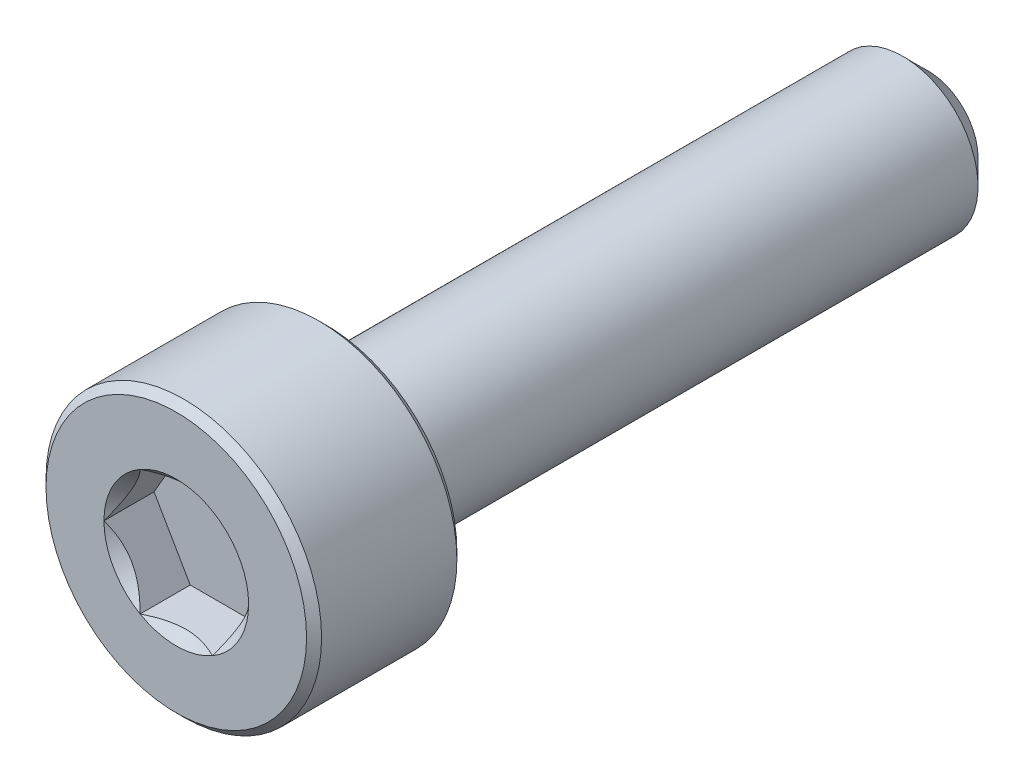
ISO-10303-21;
HEADER;
FILE_DESCRIPTION(('STEP AP214'),'2;1');
FILE_NAME('part.step','',(''),(''),'','','');
FILE_SCHEMA(('AUTOMOTIVE_DESIGN { 1 0 10303 214 1 1 1 1 }'));
ENDSEC;
DATA;
#1=APPLICATION_CONTEXT('core data for automotive mechanical design processes');
#2=APPLICATION_PROTOCOL_DEFINITION('international standard','automotive_design',2000,#1);
#3=PRODUCT_CONTEXT('',#1,'mechanical');
#4=PRODUCT('Part','Part','',(#3));
#5=PRODUCT_RELATED_PRODUCT_CATEGORY('part','',(#4));
#6=PRODUCT_DEFINITION_FORMATION('','',#4);
#7=PRODUCT_DEFINITION_CONTEXT('part definition',#1,'design');
#8=PRODUCT_DEFINITION('design','',#6,#7);
#9=PRODUCT_DEFINITION_SHAPE('','',#8);
#10=(LENGTH_UNIT() NAMED_UNIT(*) SI_UNIT(.MILLI.,.METRE.));
#11=(NAMED_UNIT(*) PLANE_ANGLE_UNIT() SI_UNIT($,.RADIAN.));
#12=(NAMED_UNIT(*) SI_UNIT($,.STERADIAN.) SOLID_ANGLE_UNIT());
#13=UNCERTAINTY_MEASURE_WITH_UNIT(LENGTH_MEASURE(1.E-05),#10,'distance_accuracy_value','');
#14=(GEOMETRIC_REPRESENTATION_CONTEXT(3) GLOBAL_UNCERTAINTY_ASSIGNED_CONTEXT((#13)) GLOBAL_UNIT_ASSIGNED_CONTEXT((#10,
#11,#12)) REPRESENTATION_CONTEXT('',''));
#15=CARTESIAN_POINT('',(0.,0.,0.));
#16=DIRECTION('',(0.,0.,1.));
#17=DIRECTION('',(1.,0.,0.));
#18=AXIS2_PLACEMENT_3D('',#15,#16,#17);
#19=CARTESIAN_POINT('',(0.,2.6,7.5));
#20=DIRECTION('',(0.,0.,1.));
#21=DIRECTION('',(1.,0.,0.));
#22=AXIS2_PLACEMENT_3D('',#19,#20,#21);
#23=PLANE('',#22);
#24=CARTESIAN_POINT('',(0.,0.,7.5));
#25=DIRECTION('',(0.,0.,1.));
#26=DIRECTION('',(1.,0.,0.));
#27=AXIS2_PLACEMENT_3D('',#24,#25,#26);
#28=CIRCLE('',#27,1.44337567297406);
#29=CARTESIAN_POINT('',(1.44337567297406,0.,7.5));
#30=VERTEX_POINT('',#29);
#31=CARTESIAN_POINT('',(0.721687836487031,1.25,7.5));
#32=VERTEX_POINT('',#31);
#33=EDGE_CURVE('E101',#30,#32,#28,.T.);
#34=ORIENTED_EDGE('',*,*,#33,.F.);
#35=CARTESIAN_POINT('',(0.721687836487031,-1.25,7.5));
#36=VERTEX_POINT('',#35);
#37=EDGE_CURVE('E61',#36,#30,#28,.T.);
#38=ORIENTED_EDGE('',*,*,#37,.F.);
#39=CARTESIAN_POINT('',(-0.721687836487033,-1.25,7.5));
#40=VERTEX_POINT('',#39);
#41=EDGE_CURVE('E331',#40,#36,#28,.T.);
#42=ORIENTED_EDGE('',*,*,#41,.F.);
#43=CARTESIAN_POINT('',(-1.44337567297406,0.,7.5));
#44=VERTEX_POINT('',#43);
#45=EDGE_CURVE('E68',#44,#40,#28,.T.);
#46=ORIENTED_EDGE('',*,*,#45,.F.);
#47=CARTESIAN_POINT('',(-0.721687836487031,1.25,7.5));
#48=VERTEX_POINT('',#47);
#49=EDGE_CURVE('E139',#48,#44,#28,.T.);
#50=ORIENTED_EDGE('',*,*,#49,.F.);
#51=EDGE_CURVE('E111',#32,#48,#28,.T.);
#52=ORIENTED_EDGE('',*,*,#51,.F.);
#53=EDGE_LOOP('',(#34,#38,#42,#46,#50,#52));
#54=FACE_BOUND('',#53,.T.);
#55=CARTESIAN_POINT('',(0.,0.,7.5));
#56=DIRECTION('',(0.,0.,-1.));
#57=DIRECTION('',(-1.,0.,0.));
#58=AXIS2_PLACEMENT_3D('',#55,#56,#57);
#59=CIRCLE('',#58,2.6);
#60=CARTESIAN_POINT('',(-2.6,0.,7.5));
#61=VERTEX_POINT('',#60);
#62=EDGE_CURVE('E55',#61,#61,#59,.T.);
#63=ORIENTED_EDGE('',*,*,#62,.F.);
#64=EDGE_LOOP('',(#63));
#65=FACE_BOUND('',#64,.T.);
#66=ADVANCED_FACE('F41',(#54,#65),#23,.T.);
#67=CARTESIAN_POINT('',(0.,0.,7.35));
#68=DIRECTION('',(0.,0.,-1.));
#69=DIRECTION('',(-1.,0.,0.));
#70=AXIS2_PLACEMENT_3D('',#67,#68,#69);
#71=CONICAL_SURFACE('',#70,2.75,0.785398163397441);
#72=ORIENTED_EDGE('',*,*,#62,.T.);
#73=EDGE_LOOP('',(#72));
#74=FACE_BOUND('',#73,.T.);
#75=CARTESIAN_POINT('',(0.,0.,7.35));
#76=DIRECTION('',(0.,0.,-1.));
#77=DIRECTION('',(-1.,0.,0.));
#78=AXIS2_PLACEMENT_3D('',#75,#76,#77);
#79=CIRCLE('',#78,2.75);
#80=CARTESIAN_POINT('',(-2.75,0.,7.35));
#81=VERTEX_POINT('',#80);
#82=EDGE_CURVE('E299',#81,#81,#79,.T.);
#83=ORIENTED_EDGE('',*,*,#82,.F.);
#84=EDGE_LOOP('',(#83));
#85=FACE_BOUND('',#84,.T.);
#86=ADVANCED_FACE('F207',(#74,#85),#71,.T.);
#87=CARTESIAN_POINT('',(0.,0.,-7.5));
#88=DIRECTION('',(0.,0.,-1.));
#89=DIRECTION('',(-1.,0.,0.));
#90=AXIS2_PLACEMENT_3D('',#87,#88,#89);
#91=CYLINDRICAL_SURFACE('',#90,2.75);
#92=ORIENTED_EDGE('',*,*,#82,.T.);
#93=EDGE_LOOP('',(#92));
#94=FACE_BOUND('',#93,.T.);
#95=CARTESIAN_POINT('',(0.,0.,4.65));
#96=DIRECTION('',(0.,0.,-1.));
#97=DIRECTION('',(-1.,0.,0.));
#98=AXIS2_PLACEMENT_3D('',#95,#96,#97);
#99=CIRCLE('',#98,2.75);
#100=CARTESIAN_POINT('',(-2.75,0.,4.65));
#101=VERTEX_POINT('',#100);
#102=EDGE_CURVE('E295',#101,#101,#99,.T.);
#103=ORIENTED_EDGE('',*,*,#102,.F.);
#104=EDGE_LOOP('',(#103));
#105=FACE_BOUND('',#104,.T.);
#106=ADVANCED_FACE('F211',(#94,#105),#91,.T.);
#107=CARTESIAN_POINT('',(0.,0.,4.5));
#108=DIRECTION('',(0.,0.,1.));
#109=DIRECTION('',(1.,0.,0.));
#110=AXIS2_PLACEMENT_3D('',#107,#108,#109);
#111=CONICAL_SURFACE('',#110,2.6,0.785398163397454);
#112=ORIENTED_EDGE('',*,*,#102,.T.);
#113=EDGE_LOOP('',(#112));
#114=FACE_BOUND('',#113,.T.);
#115=CARTESIAN_POINT('',(0.,0.,4.5));
#116=DIRECTION('',(0.,0.,-1.));
#117=DIRECTION('',(-1.,0.,0.));
#118=AXIS2_PLACEMENT_3D('',#115,#116,#117);
#119=CIRCLE('',#118,2.6);
#120=CARTESIAN_POINT('',(-2.6,0.,4.5));
#121=VERTEX_POINT('',#120);
#122=EDGE_CURVE('E291',#121,#121,#119,.T.);
#123=ORIENTED_EDGE('',*,*,#122,.F.);
#124=EDGE_LOOP('',(#123));
#125=FACE_BOUND('',#124,.T.);
#126=ADVANCED_FACE('F216',(#114,#125),#111,.T.);
#127=CARTESIAN_POINT('',(0.,2.6,4.5));
#128=DIRECTION('',(0.,0.,-1.));
#129=DIRECTION('',(-1.,0.,0.));
#130=AXIS2_PLACEMENT_3D('',#127,#128,#129);
#131=PLANE('',#130);
#132=ORIENTED_EDGE('',*,*,#122,.T.);
#133=EDGE_LOOP('',(#132));
#134=FACE_BOUND('',#133,.T.);
#135=CARTESIAN_POINT('',(0.,0.,4.5));
#136=DIRECTION('',(0.,0.,-1.));
#137=DIRECTION('',(-1.,0.,0.));
#138=AXIS2_PLACEMENT_3D('',#135,#136,#137);
#139=CIRCLE('',#138,1.5);
#140=CARTESIAN_POINT('',(-1.5,0.,4.5));
#141=VERTEX_POINT('',#140);
#142=EDGE_CURVE('E287',#141,#141,#139,.T.);
#143=ORIENTED_EDGE('',*,*,#142,.F.);
#144=EDGE_LOOP('',(#143));
#145=FACE_BOUND('',#144,.T.);
#146=ADVANCED_FACE('F224',(#134,#145),#131,.T.);
#147=CARTESIAN_POINT('',(0.,0.,-7.5));
#148=DIRECTION('',(0.,0.,-1.));
#149=DIRECTION('',(-1.,0.,0.));
#150=AXIS2_PLACEMENT_3D('',#147,#148,#149);
#151=CYLINDRICAL_SURFACE('',#150,1.5);
#152=ORIENTED_EDGE('',*,*,#142,.T.);
#153=EDGE_LOOP('',(#152));
#154=FACE_BOUND('',#153,.T.);
#155=CARTESIAN_POINT('',(0.,0.,-6.99999999999999));
#156=DIRECTION('',(0.,0.,-1.));
#157=DIRECTION('',(-1.,0.,0.));
#158=AXIS2_PLACEMENT_3D('',#155,#156,#157);
#159=CIRCLE('',#158,1.5);
#160=CARTESIAN_POINT('',(-1.5,0.,-6.99999999999999));
#161=VERTEX_POINT('',#160);
#162=EDGE_CURVE('E283',#161,#161,#159,.T.);
#163=ORIENTED_EDGE('',*,*,#162,.F.);
#164=EDGE_LOOP('',(#163));
#165=FACE_BOUND('',#164,.T.);
#166=ADVANCED_FACE('F228',(#154,#165),#151,.T.);
#167=CARTESIAN_POINT('',(0.,0.,-7.5));
#168=DIRECTION('',(0.,0.,1.));
#169=DIRECTION('',(1.,0.,0.));
#170=AXIS2_PLACEMENT_3D('',#167,#168,#169);
#171=CONICAL_SURFACE('',#170,1.,0.785398163397442);
#172=ORIENTED_EDGE('',*,*,#162,.T.);
#173=EDGE_LOOP('',(#172));
#174=FACE_BOUND('',#173,.T.);
#175=CARTESIAN_POINT('',(0.,0.,-7.5));
#176=DIRECTION('',(0.,0.,-1.));
#177=DIRECTION('',(-1.,0.,0.));
#178=AXIS2_PLACEMENT_3D('',#175,#176,#177);
#179=CIRCLE('',#178,1.);
#180=CARTESIAN_POINT('',(-1.,0.,-7.5));
#181=VERTEX_POINT('',#180);
#182=EDGE_CURVE('E259',#181,#181,#179,.T.);
#183=ORIENTED_EDGE('',*,*,#182,.F.);
#184=EDGE_LOOP('',(#183));
#185=FACE_BOUND('',#184,.T.);
#186=ADVANCED_FACE('F232',(#174,#185),#171,.T.);
#187=CARTESIAN_POINT('',(0.,1.,-7.5));
#188=DIRECTION('',(0.,0.,-1.));
#189=DIRECTION('',(-1.,0.,0.));
#190=AXIS2_PLACEMENT_3D('',#187,#188,#189);
#191=PLANE('',#190);
#192=ORIENTED_EDGE('',*,*,#182,.T.);
#193=EDGE_LOOP('',(#192));
#194=FACE_BOUND('',#193,.T.);
#195=ADVANCED_FACE('F236',(#194),#191,.T.);
#196=CARTESIAN_POINT('',(0.,0.,7.5));
#197=DIRECTION('',(0.,0.,1.));
#198=DIRECTION('',(1.,0.,0.));
#199=AXIS2_PLACEMENT_3D('',#196,#197,#198);
#200=CONICAL_SURFACE('',#199,1.44337567297406,0.78539816339745);
#201=ORIENTED_EDGE('',*,*,#51,.T.);
#202=CARTESIAN_POINT('',(-1.38510181874983,1.25,7.92237003539674));
#203=CARTESIAN_POINT('',(-1.3511198664462,1.25,7.89714624516244));
#204=CARTESIAN_POINT('',(-1.31694282655271,1.25,7.87218595606241));
#205=CARTESIAN_POINT('',(-1.24812142569207,1.25,7.82289946364711));
#206=CARTESIAN_POINT('',(-1.21347694388891,1.25,7.7985734292472));
#207=CARTESIAN_POINT('',(-1.10822083190006,1.25,7.72636172296323));
#208=CARTESIAN_POINT('',(-1.0368031370095,1.25,7.67963105585343));
#209=CARTESIAN_POINT('',(-0.887382773604421,1.25,7.58837288370571));
#210=CARTESIAN_POINT('',(-0.809230859559386,1.25,7.54408680019188));
#211=CARTESIAN_POINT('',(-0.649095969048192,1.25,7.46341771967474));
#212=CARTESIAN_POINT('',(-0.567127025311257,1.25,7.42700818355541));
#213=CARTESIAN_POINT('',(-0.443557329124525,1.25,7.38248253752399));
#214=CARTESIAN_POINT('',(-0.403672751095206,1.25,7.36961750878661));
#215=CARTESIAN_POINT('',(-0.322988211495524,1.25,7.34709732587494));
#216=CARTESIAN_POINT('',(-0.282188182544569,1.25,7.3374424088096));
#217=CARTESIAN_POINT('',(-0.200572984829334,1.25,7.32199119628927));
#218=CARTESIAN_POINT('',(-0.159769911270982,1.25,7.31613197729548));
#219=CARTESIAN_POINT('',(-0.0777868297167925,1.25,7.30837795442431));
#220=CARTESIAN_POINT('',(-0.0366068776776866,1.25,7.30648257131139));
#221=CARTESIAN_POINT('',(0.044468300338807,1.25,7.30677812948321));
#222=CARTESIAN_POINT('',(0.0843640386448806,1.25,7.3088450344818));
#223=CARTESIAN_POINT('',(0.16379054813703,1.25,7.3166895703397));
#224=CARTESIAN_POINT('',(0.203321244417683,1.25,7.32246794634046));
#225=CARTESIAN_POINT('',(0.282393987539772,1.25,7.33752741705993));
#226=CARTESIAN_POINT('',(0.321924895820598,1.25,7.34686615718743));
#227=CARTESIAN_POINT('',(0.400129026379049,1.25,7.36856655366507));
#228=CARTESIAN_POINT('',(0.438802337754634,1.25,7.38092789436938));
#229=CARTESIAN_POINT('',(0.563172797994067,1.25,7.42526147510657));
#230=CARTESIAN_POINT('',(0.647028634884196,1.25,7.46238856151275));
#231=CARTESIAN_POINT('',(0.810774513742064,1.25,7.54485212171169));
#232=CARTESIAN_POINT('',(0.89064863413494,1.25,7.59021863514241));
#233=CARTESIAN_POINT('',(1.04325497380786,1.25,7.68372168049333));
#234=CARTESIAN_POINT('',(1.11614441754118,1.25,7.73160472363706));
#235=CARTESIAN_POINT('',(1.22353403061444,1.25,7.8055883961688));
#236=CARTESIAN_POINT('',(1.25886568278664,1.25,7.83050307518734));
#237=CARTESIAN_POINT('',(1.32904842602817,1.25,7.88098117870981));
#238=CARTESIAN_POINT('',(1.36389964521094,1.25,7.90654442489043));
#239=CARTESIAN_POINT('',(1.39855118522491,1.25,7.93237628762574));
#240=B_SPLINE_CURVE_WITH_KNOTS('',3,(#202,#203,#204,#205,#206,#207,#208,#209,#210,#211,#212,
#213,#214,#215,#216,#217,#218,#219,#220,#221,#222,#223,#224,#225,#226,#227,#228,#229,#230,#231,
#232,#233,#234,#235,#236,#237,#238,#239),.UNSPECIFIED.,.F.,.F.,(4,2,2,2,2,2,2,2,2,2,2,2,2,2,2,2,
2,2,4),(0.,0.126957685716233,0.253948844536467,0.509869207561397,0.779115442456377,
1.04743984385779,1.17305649104353,1.29868241461005,1.42216852508156,1.54563658925964,
1.66530259813563,1.78499263952808,1.90670905530249,2.0284127658315,2.30272027123448,
2.57804870180744,2.83955157020837,2.96924487037104,3.0989028897939),.UNSPECIFIED.);
#241=EDGE_CURVE('E12',#32,#48,#240,.F.);
#242=ORIENTED_EDGE('',*,*,#241,.F.);
#243=EDGE_LOOP('',(#201,#242));
#244=FACE_BOUND('',#243,.T.);
#245=ADVANCED_FACE('F115',(#244),#200,.F.);
#246=ORIENTED_EDGE('',*,*,#49,.T.);
#247=CARTESIAN_POINT('',(-0.721572366433194,1.2502,7.50011548390914));
#248=CARTESIAN_POINT('',(-0.746384090710444,1.20722483292841,7.47532166805511));
#249=CARTESIAN_POINT('',(-0.771610739653664,1.16353099525405,7.45198373441869));
#250=CARTESIAN_POINT('',(-0.823050873919154,1.07443406915806,7.40925200408454));
#251=CARTESIAN_POINT('',(-0.849269254648333,1.02902250164294,7.38988199236042));
#252=CARTESIAN_POINT('',(-0.902137405038635,0.937452179064741,7.35670048341348));
#253=CARTESIAN_POINT('',(-0.928773701756386,0.891316759824116,7.34280555905266));
#254=CARTESIAN_POINT('',(-0.982632884076012,0.798029919592409,7.32139728216064));
#255=CARTESIAN_POINT('',(-1.00985412292348,0.750881350863622,7.31386794156679));
#256=CARTESIAN_POINT('',(-1.05676666578643,0.66962644311275,7.3070744980507));
#257=CARTESIAN_POINT('',(-1.07639733689152,0.635625123372061,7.30606855910435));
#258=CARTESIAN_POINT('',(-1.11562418145499,0.567682235567525,7.30776141491132));
#259=CARTESIAN_POINT('',(-1.1352203463451,0.533740682344345,7.31046102721554));
#260=CARTESIAN_POINT('',(-1.1742235548576,0.466185143542503,7.31940893031638));
#261=CARTESIAN_POINT('',(-1.19363040521232,0.432571492713227,7.32566052589971));
#262=CARTESIAN_POINT('',(-1.23212011385119,0.365905361782189,7.34137568141391));
#263=CARTESIAN_POINT('',(-1.2512028293628,0.332853128969707,7.35084062008746));
#264=CARTESIAN_POINT('',(-1.30007715810653,0.248200308399738,7.37893139068759));
#265=CARTESIAN_POINT('',(-1.32956058931202,0.197133507570364,7.3996701574522));
#266=CARTESIAN_POINT('',(-1.38737318998519,0.0969991458867465,7.44638713467148));
#267=CARTESIAN_POINT('',(-1.41570576386268,0.0479256884217316,7.47234829594677));
#268=CARTESIAN_POINT('',(-1.4434911430279,-0.000199999999999488,7.50011548390914));
#269=B_SPLINE_CURVE_WITH_KNOTS('',3,(#247,#248,#249,#250,#251,#252,#253,#254,#255,#256,#257,
#258,#259,#260,#261,#262,#263,#264,#265,#266,#267,#268),.UNSPECIFIED.,.F.,.F.,(4,2,2,2,2,2,2,2,
2,2,4),(0.,0.166533409618303,0.334037607289761,0.498880396489696,0.663307919240272,
0.780963963458824,0.89864597014845,1.01643764860773,1.13427993171549,1.32148652032141,
1.50809158792573),.UNSPECIFIED.);
#270=EDGE_CURVE('E110',#48,#44,#269,.T.);
#271=ORIENTED_EDGE('',*,*,#270,.F.);
#272=EDGE_LOOP('',(#246,#271));
#273=FACE_BOUND('',#272,.T.);
#274=ADVANCED_FACE('F342',(#273),#200,.F.);
#275=ORIENTED_EDGE('',*,*,#45,.T.);
#276=CARTESIAN_POINT('',(-1.4434911430279,0.000200000000000513,7.50011548390914));
#277=CARTESIAN_POINT('',(-1.41867941875065,-0.0427751670715862,7.47532166805511));
#278=CARTESIAN_POINT('',(-1.39345276980743,-0.0864690047459475,7.45198373441869));
#279=CARTESIAN_POINT('',(-1.34201263554194,-0.175565930841941,7.40925200408454));
#280=CARTESIAN_POINT('',(-1.31579425481276,-0.220977498357064,7.38988199236042));
#281=CARTESIAN_POINT('',(-1.26292610442246,-0.312547820935259,7.35670048341348));
#282=CARTESIAN_POINT('',(-1.23628980770471,-0.358683240175885,7.34280555905266));
#283=CARTESIAN_POINT('',(-1.18243062538508,-0.451970080407592,7.32139728216064));
#284=CARTESIAN_POINT('',(-1.15520938653761,-0.499118649136379,7.31386794156679));
#285=CARTESIAN_POINT('',(-1.10829684367467,-0.580373556887252,7.3070744980507));
#286=CARTESIAN_POINT('',(-1.08866617256958,-0.614374876627941,7.30606855910435));
#287=CARTESIAN_POINT('',(-1.04943932800611,-0.682317764432477,7.30776141491132));
#288=CARTESIAN_POINT('',(-1.02984316311599,-0.716259317655657,7.31046102721554));
#289=CARTESIAN_POINT('',(-0.990839954603499,-0.783814856457499,7.31940893031638));
#290=CARTESIAN_POINT('',(-0.971433104248771,-0.817428507286775,7.32566052589971));
#291=CARTESIAN_POINT('',(-0.932943395609905,-0.884094638217813,7.34137568141391));
#292=CARTESIAN_POINT('',(-0.913860680098301,-0.917146871030295,7.35084062008746));
#293=CARTESIAN_POINT('',(-0.864986351354568,-1.00179969160026,7.37893139068759));
#294=CARTESIAN_POINT('',(-0.835502920149076,-1.05286649242964,7.3996701574522));
#295=CARTESIAN_POINT('',(-0.777690319475909,-1.15300085411325,7.44638713467148));
#296=CARTESIAN_POINT('',(-0.749357745598417,-1.20207431157827,7.47234829594677));
#297=CARTESIAN_POINT('',(-0.721572366433195,-1.2502,7.50011548390914));
#298=B_SPLINE_CURVE_WITH_KNOTS('',3,(#276,#277,#278,#279,#280,#281,#282,#283,#284,#285,#286,
#287,#288,#289,#290,#291,#292,#293,#294,#295,#296,#297),.UNSPECIFIED.,.F.,.F.,(4,2,2,2,2,2,2,2,
2,2,4),(0.,0.166533409618304,0.334037607289762,0.498880396489698,0.663307919240275,
0.780963963458827,0.898645970148453,1.01643764860773,1.1342799317155,1.32148652032141,
1.50809158792573),.UNSPECIFIED.);
#299=EDGE_CURVE('E151',#44,#40,#298,.T.);
#300=ORIENTED_EDGE('',*,*,#299,.F.);
#301=EDGE_LOOP('',(#275,#300));
#302=FACE_BOUND('',#301,.T.);
#303=ADVANCED_FACE('F337',(#302),#200,.F.);
#304=ORIENTED_EDGE('',*,*,#41,.T.);
#305=CARTESIAN_POINT('',(-1.38510181874983,-1.25,7.92237003539674));
#306=CARTESIAN_POINT('',(-1.3511198664462,-1.25,7.89714624516244));
#307=CARTESIAN_POINT('',(-1.31694282655271,-1.25,7.87218595606241));
#308=CARTESIAN_POINT('',(-1.24812142569207,-1.25,7.82289946364711));
#309=CARTESIAN_POINT('',(-1.21347694388891,-1.25,7.7985734292472));
#310=CARTESIAN_POINT('',(-1.10822083190006,-1.25,7.72636172296323));
#311=CARTESIAN_POINT('',(-1.0368031370095,-1.25,7.67963105585342));
#312=CARTESIAN_POINT('',(-0.887382773604423,-1.25,7.58837288370571));
#313=CARTESIAN_POINT('',(-0.809230859559388,-1.25,7.54408680019188));
#314=CARTESIAN_POINT('',(-0.649095969048194,-1.25,7.46341771967474));
#315=CARTESIAN_POINT('',(-0.567127025311258,-1.25,7.42700818355541));
#316=CARTESIAN_POINT('',(-0.443557329124527,-1.25,7.38248253752399));
#317=CARTESIAN_POINT('',(-0.403672751095207,-1.25,7.36961750878661));
#318=CARTESIAN_POINT('',(-0.322988211495525,-1.25,7.34709732587493));
#319=CARTESIAN_POINT('',(-0.28218818254457,-1.25,7.3374424088096));
#320=CARTESIAN_POINT('',(-0.200572984829335,-1.25,7.32199119628927));
#321=CARTESIAN_POINT('',(-0.159769911270982,-1.25,7.31613197729548));
#322=CARTESIAN_POINT('',(-0.0777868297167931,-1.25,7.30837795442431));
#323=CARTESIAN_POINT('',(-0.0366068776776872,-1.25,7.30648257131138));
#324=CARTESIAN_POINT('',(0.0444683003388065,-1.25,7.30677812948321));
#325=CARTESIAN_POINT('',(0.0843640386448802,-1.25,7.3088450344818));
#326=CARTESIAN_POINT('',(0.16379054813703,-1.25,7.3166895703397));
#327=CARTESIAN_POINT('',(0.203321244417683,-1.25,7.32246794634046));
#328=CARTESIAN_POINT('',(0.282393987539771,-1.25,7.33752741705993));
#329=CARTESIAN_POINT('',(0.321924895820597,-1.25,7.34686615718743));
#330=CARTESIAN_POINT('',(0.400129026379048,-1.25,7.36856655366507));
#331=CARTESIAN_POINT('',(0.438802337754633,-1.25,7.38092789436938));
#332=CARTESIAN_POINT('',(0.563172797994066,-1.25,7.42526147510656));
#333=CARTESIAN_POINT('',(0.647028634884195,-1.25,7.46238856151275));
#334=CARTESIAN_POINT('',(0.810774513742063,-1.25,7.54485212171168));
#335=CARTESIAN_POINT('',(0.890648634134939,-1.25,7.59021863514241));
#336=CARTESIAN_POINT('',(1.04325497380785,-1.25,7.68372168049333));
#337=CARTESIAN_POINT('',(1.11614441754118,-1.25,7.73160472363706));
#338=CARTESIAN_POINT('',(1.22353403061444,-1.25,7.8055883961688));
#339=CARTESIAN_POINT('',(1.25886568278664,-1.25,7.83050307518733));
#340=CARTESIAN_POINT('',(1.32904842602817,-1.25,7.8809811787098));
#341=CARTESIAN_POINT('',(1.36389964521094,-1.25,7.90654442489043));
#342=CARTESIAN_POINT('',(1.3985511852249,-1.25,7.93237628762573));
#343=B_SPLINE_CURVE_WITH_KNOTS('',3,(#305,#306,#307,#308,#309,#310,#311,#312,#313,#314,#315,
#316,#317,#318,#319,#320,#321,#322,#323,#324,#325,#326,#327,#328,#329,#330,#331,#332,#333,#334,
#335,#336,#337,#338,#339,#340,#341,#342),.UNSPECIFIED.,.F.,.F.,(4,2,2,2,2,2,2,2,2,2,2,2,2,2,2,2,
2,2,4),(0.,0.126957685716234,0.253948844536468,0.509869207561398,0.779115442456377,
1.04743984385779,1.17305649104353,1.29868241461005,1.42216852508156,1.54563658925964,
1.66530259813563,1.78499263952808,1.9067090553025,2.02841276583151,2.30272027123448,
2.57804870180744,2.83955157020837,2.96924487037104,3.0989028897939),.UNSPECIFIED.);
#344=EDGE_CURVE('E171',#40,#36,#343,.T.);
#345=ORIENTED_EDGE('',*,*,#344,.F.);
#346=EDGE_LOOP('',(#304,#345));
#347=FACE_BOUND('',#346,.T.);
#348=ADVANCED_FACE('F332',(#347),#200,.F.);
#349=ORIENTED_EDGE('',*,*,#37,.T.);
#350=CARTESIAN_POINT('',(0.721572366433193,-1.2502,7.50011548390914));
#351=CARTESIAN_POINT('',(0.746384090710443,-1.20722483292841,7.4753216680551));
#352=CARTESIAN_POINT('',(0.771610739653663,-1.16353099525405,7.45198373441868));
#353=CARTESIAN_POINT('',(0.823050873919153,-1.07443406915806,7.40925200408454));
#354=CARTESIAN_POINT('',(0.849269254648332,-1.02902250164294,7.38988199236041));
#355=CARTESIAN_POINT('',(0.902137405038634,-0.93745217906474,7.35670048341348));
#356=CARTESIAN_POINT('',(0.928773701756385,-0.891316759824115,7.34280555905266));
#357=CARTESIAN_POINT('',(0.982632884076011,-0.798029919592408,7.32139728216064));
#358=CARTESIAN_POINT('',(1.00985412292348,-0.750881350863621,7.31386794156679));
#359=CARTESIAN_POINT('',(1.05676666578643,-0.669626443112749,7.3070744980507));
#360=CARTESIAN_POINT('',(1.07639733689152,-0.63562512337206,7.30606855910435));
#361=CARTESIAN_POINT('',(1.11562418145498,-0.567682235567524,7.30776141491132));
#362=CARTESIAN_POINT('',(1.1352203463451,-0.533740682344344,7.31046102721554));
#363=CARTESIAN_POINT('',(1.1742235548576,-0.466185143542502,7.31940893031638));
#364=CARTESIAN_POINT('',(1.19363040521232,-0.432571492713226,7.32566052589971));
#365=CARTESIAN_POINT('',(1.23212011385119,-0.365905361782188,7.34137568141391));
#366=CARTESIAN_POINT('',(1.25120282936279,-0.332853128969706,7.35084062008746));
#367=CARTESIAN_POINT('',(1.30007715810653,-0.248200308399737,7.37893139068759));
#368=CARTESIAN_POINT('',(1.32956058931202,-0.197133507570362,7.3996701574522));
#369=CARTESIAN_POINT('',(1.38737318998519,-0.096999145886745,7.44638713467148));
#370=CARTESIAN_POINT('',(1.41570576386268,-0.0479256884217301,7.47234829594677));
#371=CARTESIAN_POINT('',(1.4434911430279,0.00020000000000041,7.50011548390914));
#372=B_SPLINE_CURVE_WITH_KNOTS('',3,(#350,#351,#352,#353,#354,#355,#356,#357,#358,#359,#360,
#361,#362,#363,#364,#365,#366,#367,#368,#369,#370,#371),.UNSPECIFIED.,.F.,.F.,(4,2,2,2,2,2,2,2,
2,2,4),(0.,0.166533409618303,0.33403760728976,0.498880396489697,0.663307919240272,
0.780963963458824,0.89864597014845,1.01643764860773,1.13427993171549,1.32148652032141,
1.50809158792574),.UNSPECIFIED.);
#373=EDGE_CURVE('E128',#36,#30,#372,.T.);
#374=ORIENTED_EDGE('',*,*,#373,.F.);
#375=EDGE_LOOP('',(#349,#374));
#376=FACE_BOUND('',#375,.T.);
#377=ADVANCED_FACE('F164',(#376),#200,.F.);
#378=ORIENTED_EDGE('',*,*,#33,.T.);
#379=CARTESIAN_POINT('',(1.4434911430279,-0.000199999999999486,7.50011548390914));
#380=CARTESIAN_POINT('',(1.41867941875065,0.042775167071587,7.47532166805511));
#381=CARTESIAN_POINT('',(1.39345276980743,0.0864690047459482,7.45198373441868));
#382=CARTESIAN_POINT('',(1.34201263554194,0.175565930841942,7.40925200408454));
#383=CARTESIAN_POINT('',(1.31579425481276,0.220977498357064,7.38988199236042));
#384=CARTESIAN_POINT('',(1.26292610442246,0.31254782093526,7.35670048341348));
#385=CARTESIAN_POINT('',(1.23628980770471,0.358683240175885,7.34280555905266));
#386=CARTESIAN_POINT('',(1.18243062538508,0.451970080407592,7.32139728216064));
#387=CARTESIAN_POINT('',(1.15520938653761,0.499118649136379,7.31386794156679));
#388=CARTESIAN_POINT('',(1.10829684367467,0.580373556887252,7.3070744980507));
#389=CARTESIAN_POINT('',(1.08866617256958,0.61437487662794,7.30606855910435));
#390=CARTESIAN_POINT('',(1.04943932800611,0.682317764432477,7.30776141491132));
#391=CARTESIAN_POINT('',(1.02984316311599,0.716259317655657,7.31046102721554));
#392=CARTESIAN_POINT('',(0.990839954603499,0.783814856457499,7.31940893031638));
#393=CARTESIAN_POINT('',(0.971433104248771,0.817428507286774,7.32566052589971));
#394=CARTESIAN_POINT('',(0.932943395609905,0.884094638217812,7.34137568141391));
#395=CARTESIAN_POINT('',(0.913860680098301,0.917146871030295,7.35084062008746));
#396=CARTESIAN_POINT('',(0.864986351354568,1.00179969160026,7.37893139068759));
#397=CARTESIAN_POINT('',(0.835502920149076,1.05286649242964,7.3996701574522));
#398=CARTESIAN_POINT('',(0.777690319475908,1.15300085411325,7.44638713467148));
#399=CARTESIAN_POINT('',(0.749357745598417,1.20207431157827,7.47234829594677));
#400=CARTESIAN_POINT('',(0.721572366433194,1.2502,7.50011548390914));
#401=B_SPLINE_CURVE_WITH_KNOTS('',3,(#379,#380,#381,#382,#383,#384,#385,#386,#387,#388,#389,
#390,#391,#392,#393,#394,#395,#396,#397,#398,#399,#400),.UNSPECIFIED.,.F.,.F.,(4,2,2,2,2,2,2,2,
2,2,4),(0.,0.166533409618303,0.334037607289761,0.498880396489697,0.663307919240273,
0.780963963458825,0.898645970148451,1.01643764860773,1.13427993171549,1.32148652032141,
1.50809158792573),.UNSPECIFIED.);
#402=EDGE_CURVE('E105',#30,#32,#401,.T.);
#403=ORIENTED_EDGE('',*,*,#402,.F.);
#404=EDGE_LOOP('',(#378,#403));
#405=FACE_BOUND('',#404,.T.);
#406=ADVANCED_FACE('F103',(#405),#200,.F.);
#407=CARTESIAN_POINT('',(0.,2.6,6.5));
#408=DIRECTION('',(0.,0.,1.));
#409=DIRECTION('',(1.,0.,0.));
#410=AXIS2_PLACEMENT_3D('',#407,#408,#409);
#411=PLANE('',#410);
#412=DIRECTION('',(0.5,-0.866025403784439,0.));
#413=VECTOR('',#412,1.);
#414=CARTESIAN_POINT('',(1.44337567297406,0.,6.5));
#415=LINE('',#414,#413);
#416=CARTESIAN_POINT('',(0.721687836487032,1.25,6.5));
#417=VERTEX_POINT('',#416);
#418=CARTESIAN_POINT('',(1.44337567297406,0.,6.5));
#419=VERTEX_POINT('',#418);
#420=EDGE_CURVE('E251',#417,#419,#415,.T.);
#421=ORIENTED_EDGE('',*,*,#420,.F.);
#422=DIRECTION('',(1.,0.,0.));
#423=VECTOR('',#422,1.);
#424=CARTESIAN_POINT('',(0.721687836487032,1.25,6.5));
#425=LINE('',#424,#423);
#426=CARTESIAN_POINT('',(-0.721687836487032,1.25,6.5));
#427=VERTEX_POINT('',#426);
#428=EDGE_CURVE('E132',#427,#417,#425,.T.);
#429=ORIENTED_EDGE('',*,*,#428,.F.);
#430=DIRECTION('',(0.5,0.866025403784439,0.));
#431=VECTOR('',#430,1.);
#432=CARTESIAN_POINT('',(-0.721687836487032,1.25,6.5));
#433=LINE('',#432,#431);
#434=CARTESIAN_POINT('',(-1.44337567297406,0.,6.5));
#435=VERTEX_POINT('',#434);
#436=EDGE_CURVE('E267',#435,#427,#433,.T.);
#437=ORIENTED_EDGE('',*,*,#436,.F.);
#438=DIRECTION('',(-0.5,0.866025403784439,0.));
#439=VECTOR('',#438,1.);
#440=CARTESIAN_POINT('',(-1.44337567297406,0.,6.5));
#441=LINE('',#440,#439);
#442=CARTESIAN_POINT('',(-0.721687836487033,-1.25,6.5));
#443=VERTEX_POINT('',#442);
#444=EDGE_CURVE('E318',#443,#435,#441,.T.);
#445=ORIENTED_EDGE('',*,*,#444,.F.);
#446=DIRECTION('',(-1.,0.,0.));
#447=VECTOR('',#446,1.);
#448=CARTESIAN_POINT('',(-0.721687836487033,-1.25,6.5));
#449=LINE('',#448,#447);
#450=CARTESIAN_POINT('',(0.721687836487031,-1.25,6.5));
#451=VERTEX_POINT('',#450);
#452=EDGE_CURVE('E261',#451,#443,#449,.T.);
#453=ORIENTED_EDGE('',*,*,#452,.F.);
#454=DIRECTION('',(-0.5,-0.866025403784439,0.));
#455=VECTOR('',#454,1.);
#456=CARTESIAN_POINT('',(0.721687836487031,-1.25,6.5));
#457=LINE('',#456,#455);
#458=EDGE_CURVE('E254',#419,#451,#457,.T.);
#459=ORIENTED_EDGE('',*,*,#458,.F.);
#460=EDGE_LOOP('',(#421,#429,#437,#445,#453,#459));
#461=FACE_BOUND('',#460,.T.);
#462=ADVANCED_FACE('F163',(#461),#411,.T.);
#463=CARTESIAN_POINT('',(0.721687836487032,1.25,1.68118692087013));
#464=DIRECTION('',(0.,1.,0.));
#465=DIRECTION('',(0.,0.,1.));
#466=AXIS2_PLACEMENT_3D('',#463,#464,#465);
#467=PLANE('',#466);
#468=DIRECTION('',(0.,0.,1.));
#469=VECTOR('',#468,1.);
#470=CARTESIAN_POINT('',(0.721687836487032,1.25,1.68118692087013));
#471=LINE('',#470,#469);
#472=EDGE_CURVE('E124',#417,#32,#471,.T.);
#473=ORIENTED_EDGE('',*,*,#472,.T.);
#474=ORIENTED_EDGE('',*,*,#241,.T.);
#475=DIRECTION('',(0.,0.,1.));
#476=VECTOR('',#475,1.);
#477=CARTESIAN_POINT('',(-0.721687836487032,1.25,1.68118692087013));
#478=LINE('',#477,#476);
#479=EDGE_CURVE('E135',#427,#48,#478,.T.);
#480=ORIENTED_EDGE('',*,*,#479,.F.);
#481=ORIENTED_EDGE('',*,*,#428,.T.);
#482=EDGE_LOOP('',(#473,#474,#480,#481));
#483=FACE_BOUND('',#482,.T.);
#484=ADVANCED_FACE('F130',(#483),#467,.F.);
#485=CARTESIAN_POINT('',(-0.721687836487032,1.25,1.68118692087013));
#486=DIRECTION('',(-0.866025403784438,0.5,0.));
#487=DIRECTION('',(-0.5,-0.866025403784439,0.));
#488=AXIS2_PLACEMENT_3D('',#485,#486,#487);
#489=PLANE('',#488);
#490=ORIENTED_EDGE('',*,*,#479,.T.);
#491=ORIENTED_EDGE('',*,*,#270,.T.);
#492=DIRECTION('',(0.,0.,1.));
#493=VECTOR('',#492,1.);
#494=CARTESIAN_POINT('',(-1.44337567297406,0.,1.68118692087013));
#495=LINE('',#494,#493);
#496=EDGE_CURVE('E275',#435,#44,#495,.T.);
#497=ORIENTED_EDGE('',*,*,#496,.F.);
#498=ORIENTED_EDGE('',*,*,#436,.T.);
#499=EDGE_LOOP('',(#490,#491,#497,#498));
#500=FACE_BOUND('',#499,.T.);
#501=ADVANCED_FACE('F158',(#500),#489,.F.);
#502=CARTESIAN_POINT('',(-1.44337567297406,0.,1.68118692087013));
#503=DIRECTION('',(-0.866025403784438,-0.5,0.));
#504=DIRECTION('',(0.5,-0.866025403784439,0.));
#505=AXIS2_PLACEMENT_3D('',#502,#503,#504);
#506=PLANE('',#505);
#507=ORIENTED_EDGE('',*,*,#496,.T.);
#508=ORIENTED_EDGE('',*,*,#299,.T.);
#509=DIRECTION('',(0.,0.,1.));
#510=VECTOR('',#509,1.);
#511=CARTESIAN_POINT('',(-0.721687836487033,-1.25,1.68118692087013));
#512=LINE('',#511,#510);
#513=EDGE_CURVE('E271',#443,#40,#512,.T.);
#514=ORIENTED_EDGE('',*,*,#513,.F.);
#515=ORIENTED_EDGE('',*,*,#444,.T.);
#516=EDGE_LOOP('',(#507,#508,#514,#515));
#517=FACE_BOUND('',#516,.T.);
#518=ADVANCED_FACE('F196',(#517),#506,.F.);
#519=CARTESIAN_POINT('',(-0.721687836487033,-1.25,1.68118692087013));
#520=DIRECTION('',(0.,-1.,0.));
#521=DIRECTION('',(1.,0.,0.));
#522=AXIS2_PLACEMENT_3D('',#519,#520,#521);
#523=PLANE('',#522);
#524=ORIENTED_EDGE('',*,*,#513,.T.);
#525=ORIENTED_EDGE('',*,*,#344,.T.);
#526=DIRECTION('',(0.,0.,1.));
#527=VECTOR('',#526,1.);
#528=CARTESIAN_POINT('',(0.721687836487031,-1.25,1.68118692087013));
#529=LINE('',#528,#527);
#530=EDGE_CURVE('E268',#451,#36,#529,.T.);
#531=ORIENTED_EDGE('',*,*,#530,.F.);
#532=ORIENTED_EDGE('',*,*,#452,.T.);
#533=EDGE_LOOP('',(#524,#525,#531,#532));
#534=FACE_BOUND('',#533,.T.);
#535=ADVANCED_FACE('F192',(#534),#523,.F.);
#536=CARTESIAN_POINT('',(0.721687836487031,-1.25,1.68118692087013));
#537=DIRECTION('',(0.866025403784438,-0.5,0.));
#538=DIRECTION('',(0.5,0.866025403784439,0.));
#539=AXIS2_PLACEMENT_3D('',#536,#537,#538);
#540=PLANE('',#539);
#541=ORIENTED_EDGE('',*,*,#530,.T.);
#542=ORIENTED_EDGE('',*,*,#373,.T.);
#543=DIRECTION('',(0.,0.,1.));
#544=VECTOR('',#543,1.);
#545=CARTESIAN_POINT('',(1.44337567297406,0.,1.68118692087013));
#546=LINE('',#545,#544);
#547=EDGE_CURVE('E126',#419,#30,#546,.T.);
#548=ORIENTED_EDGE('',*,*,#547,.F.);
#549=ORIENTED_EDGE('',*,*,#458,.T.);
#550=EDGE_LOOP('',(#541,#542,#548,#549));
#551=FACE_BOUND('',#550,.T.);
#552=ADVANCED_FACE('F189',(#551),#540,.F.);
#553=CARTESIAN_POINT('',(1.44337567297406,0.,1.68118692087013));
#554=DIRECTION('',(0.866025403784439,0.5,0.));
#555=DIRECTION('',(-0.5,0.866025403784439,0.));
#556=AXIS2_PLACEMENT_3D('',#553,#554,#555);
#557=PLANE('',#556);
#558=ORIENTED_EDGE('',*,*,#547,.T.);
#559=ORIENTED_EDGE('',*,*,#402,.T.);
#560=ORIENTED_EDGE('',*,*,#472,.F.);
#561=ORIENTED_EDGE('',*,*,#420,.T.);
#562=EDGE_LOOP('',(#558,#559,#560,#561));
#563=FACE_BOUND('',#562,.T.);
#564=ADVANCED_FACE('F123',(#563),#557,.F.);
#565=CLOSED_SHELL('',(#66,#86,#106,#126,#146,#166,#186,#195,#245,#274,#303,#348,#377,#406,#462,
#484,#501,#518,#535,#552,#564));
#566=MANIFOLD_SOLID_BREP('B2',#565);
#567=ADVANCED_BREP_SHAPE_REPRESENTATION('',(#18,#566),#14);
#568=SHAPE_DEFINITION_REPRESENTATION(#9,#567);
ENDSEC;
END-ISO-10303-21;
